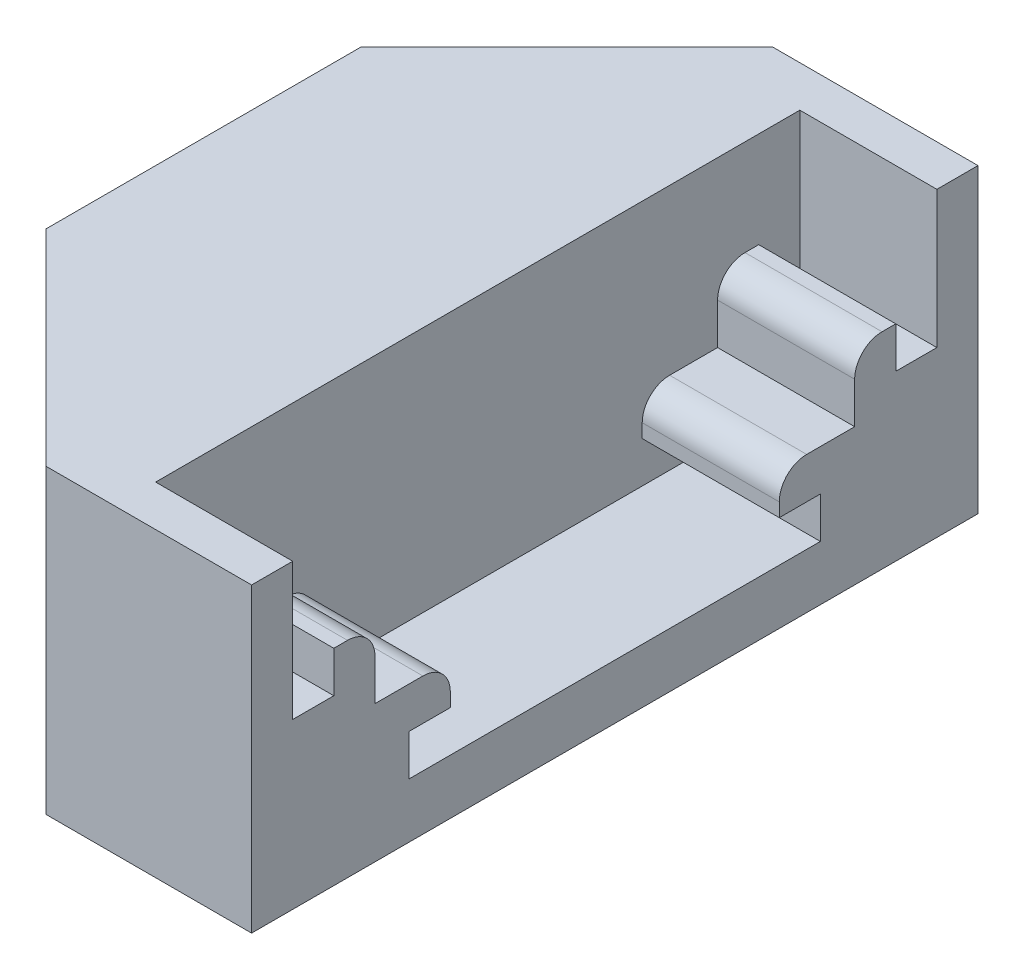
ISO-10303-21;
HEADER;
FILE_DESCRIPTION(('STEP AP214'),'2;1');
FILE_NAME('part.step','',(''),(''),'','','');
FILE_SCHEMA(('AUTOMOTIVE_DESIGN { 1 0 10303 214 1 1 1 1 }'));
ENDSEC;
DATA;
#1=APPLICATION_CONTEXT('core data for automotive mechanical design processes');
#2=APPLICATION_PROTOCOL_DEFINITION('international standard','automotive_design',2000,#1);
#3=PRODUCT_CONTEXT('',#1,'mechanical');
#4=PRODUCT('Part','Part','',(#3));
#5=PRODUCT_RELATED_PRODUCT_CATEGORY('part','',(#4));
#6=PRODUCT_DEFINITION_FORMATION('','',#4);
#7=PRODUCT_DEFINITION_CONTEXT('part definition',#1,'design');
#8=PRODUCT_DEFINITION('design','',#6,#7);
#9=PRODUCT_DEFINITION_SHAPE('','',#8);
#10=(LENGTH_UNIT() NAMED_UNIT(*) SI_UNIT(.MILLI.,.METRE.));
#11=(NAMED_UNIT(*) PLANE_ANGLE_UNIT() SI_UNIT($,.RADIAN.));
#12=(NAMED_UNIT(*) SI_UNIT($,.STERADIAN.) SOLID_ANGLE_UNIT());
#13=UNCERTAINTY_MEASURE_WITH_UNIT(LENGTH_MEASURE(1.E-05),#10,'distance_accuracy_value','');
#14=(GEOMETRIC_REPRESENTATION_CONTEXT(3) GLOBAL_UNCERTAINTY_ASSIGNED_CONTEXT((#13)) GLOBAL_UNIT_ASSIGNED_CONTEXT((#10,
#11,#12)) REPRESENTATION_CONTEXT('',''));
#15=CARTESIAN_POINT('',(0.,0.,0.));
#16=DIRECTION('',(0.,0.,1.));
#17=DIRECTION('',(1.,0.,0.));
#18=AXIS2_PLACEMENT_3D('',#15,#16,#17);
#19=CARTESIAN_POINT('',(10.,-27.5,0.));
#20=DIRECTION('',(0.,1.,0.));
#21=DIRECTION('',(0.,0.,1.));
#22=AXIS2_PLACEMENT_3D('',#19,#20,#21);
#23=PLANE('',#22);
#24=DIRECTION('',(-1.,0.,0.));
#25=VECTOR('',#24,1.);
#26=CARTESIAN_POINT('',(10.,-27.5,26.5));
#27=LINE('',#26,#25);
#28=CARTESIAN_POINT('',(10.,-27.5,26.5));
#29=VERTEX_POINT('',#28);
#30=CARTESIAN_POINT('',(-4.99999999999995,-27.5,26.5));
#31=VERTEX_POINT('',#30);
#32=EDGE_CURVE('E368',#29,#31,#27,.T.);
#33=ORIENTED_EDGE('',*,*,#32,.T.);
#34=DIRECTION('',(0.707106781186549,0.,0.707106781186546));
#35=VECTOR('',#34,1.);
#36=CARTESIAN_POINT('',(-20.,-27.5,11.5));
#37=LINE('',#36,#35);
#38=CARTESIAN_POINT('',(-20.,-27.5,11.5));
#39=VERTEX_POINT('',#38);
#40=EDGE_CURVE('E11',#31,#39,#37,.F.);
#41=ORIENTED_EDGE('',*,*,#40,.T.);
#42=DIRECTION('',(0.,0.,1.));
#43=VECTOR('',#42,1.);
#44=CARTESIAN_POINT('',(-20.,-27.5,26.5));
#45=LINE('',#44,#43);
#46=CARTESIAN_POINT('',(-20.,-27.5,-11.5));
#47=VERTEX_POINT('',#46);
#48=EDGE_CURVE('E335',#47,#39,#45,.T.);
#49=ORIENTED_EDGE('',*,*,#48,.F.);
#50=DIRECTION('',(0.707106781186549,0.,-0.707106781186546));
#51=VECTOR('',#50,1.);
#52=CARTESIAN_POINT('',(-20.,-27.5,-11.5));
#53=LINE('',#52,#51);
#54=CARTESIAN_POINT('',(-4.99999999999995,-27.5,-26.5));
#55=VERTEX_POINT('',#54);
#56=EDGE_CURVE('E255',#55,#47,#53,.F.);
#57=ORIENTED_EDGE('',*,*,#56,.F.);
#58=DIRECTION('',(-1.,0.,0.));
#59=VECTOR('',#58,1.);
#60=CARTESIAN_POINT('',(10.,-27.5,-26.5));
#61=LINE('',#60,#59);
#62=CARTESIAN_POINT('',(10.,-27.5,-26.5));
#63=VERTEX_POINT('',#62);
#64=EDGE_CURVE('E279',#63,#55,#61,.T.);
#65=ORIENTED_EDGE('',*,*,#64,.F.);
#66=DIRECTION('',(0.,0.,-1.));
#67=VECTOR('',#66,1.);
#68=CARTESIAN_POINT('',(10.,-27.5,0.));
#69=LINE('',#68,#67);
#70=EDGE_CURVE('E339',#29,#63,#69,.T.);
#71=ORIENTED_EDGE('',*,*,#70,.F.);
#72=EDGE_LOOP('',(#33,#41,#49,#57,#65,#71));
#73=FACE_BOUND('',#72,.T.);
#74=ADVANCED_FACE('F45',(#73),#23,.F.);
#75=CARTESIAN_POINT('',(10.,-23.5,15.));
#76=DIRECTION('',(0.,-1.,0.));
#77=DIRECTION('',(0.,0.,-1.));
#78=AXIS2_PLACEMENT_3D('',#75,#76,#77);
#79=PLANE('',#78);
#80=DIRECTION('',(0.,0.,1.));
#81=VECTOR('',#80,1.);
#82=CARTESIAN_POINT('',(0.,-23.5,15.));
#83=LINE('',#82,#81);
#84=CARTESIAN_POINT('',(0.,-23.5,-15.));
#85=VERTEX_POINT('',#84);
#86=CARTESIAN_POINT('',(0.,-23.5,15.));
#87=VERTEX_POINT('',#86);
#88=EDGE_CURVE('E337',#85,#87,#83,.T.);
#89=ORIENTED_EDGE('',*,*,#88,.T.);
#90=DIRECTION('',(-1.,0.,0.));
#91=VECTOR('',#90,1.);
#92=CARTESIAN_POINT('',(10.,-23.5,15.));
#93=LINE('',#92,#91);
#94=CARTESIAN_POINT('',(10.,-23.5,15.));
#95=VERTEX_POINT('',#94);
#96=EDGE_CURVE('E418',#95,#87,#93,.T.);
#97=ORIENTED_EDGE('',*,*,#96,.F.);
#98=DIRECTION('',(0.,0.,1.));
#99=VECTOR('',#98,1.);
#100=CARTESIAN_POINT('',(10.,-23.5,15.));
#101=LINE('',#100,#99);
#102=CARTESIAN_POINT('',(10.,-23.5,-15.));
#103=VERTEX_POINT('',#102);
#104=EDGE_CURVE('E341',#103,#95,#101,.T.);
#105=ORIENTED_EDGE('',*,*,#104,.F.);
#106=DIRECTION('',(-1.,0.,0.));
#107=VECTOR('',#106,1.);
#108=CARTESIAN_POINT('',(10.,-23.5,-15.));
#109=LINE('',#108,#107);
#110=EDGE_CURVE('E301',#103,#85,#109,.T.);
#111=ORIENTED_EDGE('',*,*,#110,.T.);
#112=EDGE_LOOP('',(#89,#97,#105,#111));
#113=FACE_BOUND('',#112,.T.);
#114=ADVANCED_FACE('F524',(#113),#79,.F.);
#115=CARTESIAN_POINT('',(10.,-20.5,15.));
#116=DIRECTION('',(0.,0.,1.));
#117=DIRECTION('',(1.,0.,0.));
#118=AXIS2_PLACEMENT_3D('',#115,#116,#117);
#119=PLANE('',#118);
#120=DIRECTION('',(0.,1.,0.));
#121=VECTOR('',#120,1.);
#122=CARTESIAN_POINT('',(0.,-20.5,15.));
#123=LINE('',#122,#121);
#124=CARTESIAN_POINT('',(0.,-20.5,15.));
#125=VERTEX_POINT('',#124);
#126=EDGE_CURVE('E371',#87,#125,#123,.T.);
#127=ORIENTED_EDGE('',*,*,#126,.T.);
#128=DIRECTION('',(-1.,0.,0.));
#129=VECTOR('',#128,1.);
#130=CARTESIAN_POINT('',(10.,-20.5,15.));
#131=LINE('',#130,#129);
#132=CARTESIAN_POINT('',(10.,-20.5,15.));
#133=VERTEX_POINT('',#132);
#134=EDGE_CURVE('E415',#133,#125,#131,.T.);
#135=ORIENTED_EDGE('',*,*,#134,.F.);
#136=DIRECTION('',(0.,1.,0.));
#137=VECTOR('',#136,1.);
#138=CARTESIAN_POINT('',(10.,-20.5,15.));
#139=LINE('',#138,#137);
#140=EDGE_CURVE('E344',#95,#133,#139,.T.);
#141=ORIENTED_EDGE('',*,*,#140,.F.);
#142=ORIENTED_EDGE('',*,*,#96,.T.);
#143=EDGE_LOOP('',(#127,#135,#141,#142));
#144=FACE_BOUND('',#143,.T.);
#145=ADVANCED_FACE('F531',(#144),#119,.F.);
#146=CARTESIAN_POINT('',(10.,-20.5,12.));
#147=DIRECTION('',(0.,1.,0.));
#148=DIRECTION('',(0.,0.,1.));
#149=AXIS2_PLACEMENT_3D('',#146,#147,#148);
#150=PLANE('',#149);
#151=DIRECTION('',(0.,0.,-1.));
#152=VECTOR('',#151,1.);
#153=CARTESIAN_POINT('',(0.,-20.5,12.));
#154=LINE('',#153,#152);
#155=CARTESIAN_POINT('',(0.,-20.5,12.));
#156=VERTEX_POINT('',#155);
#157=EDGE_CURVE('E374',#125,#156,#154,.T.);
#158=ORIENTED_EDGE('',*,*,#157,.T.);
#159=DIRECTION('',(-1.,0.,0.));
#160=VECTOR('',#159,1.);
#161=CARTESIAN_POINT('',(10.,-20.5,12.));
#162=LINE('',#161,#160);
#163=CARTESIAN_POINT('',(10.,-20.5,12.));
#164=VERTEX_POINT('',#163);
#165=EDGE_CURVE('E412',#164,#156,#162,.T.);
#166=ORIENTED_EDGE('',*,*,#165,.F.);
#167=DIRECTION('',(0.,0.,-1.));
#168=VECTOR('',#167,1.);
#169=CARTESIAN_POINT('',(10.,-20.5,12.));
#170=LINE('',#169,#168);
#171=EDGE_CURVE('E346',#133,#164,#170,.T.);
#172=ORIENTED_EDGE('',*,*,#171,.F.);
#173=ORIENTED_EDGE('',*,*,#134,.T.);
#174=EDGE_LOOP('',(#158,#166,#172,#173));
#175=FACE_BOUND('',#174,.T.);
#176=ADVANCED_FACE('F533',(#175),#150,.F.);
#177=CARTESIAN_POINT('',(10.,-20.5,12.));
#178=DIRECTION('',(0.,0.,1.));
#179=DIRECTION('',(0.,-1.,0.));
#180=AXIS2_PLACEMENT_3D('',#177,#178,#179);
#181=PLANE('',#180);
#182=DIRECTION('',(0.,1.,0.));
#183=VECTOR('',#182,1.);
#184=CARTESIAN_POINT('',(0.,-20.5,12.));
#185=LINE('',#184,#183);
#186=CARTESIAN_POINT('',(0.,-19.5,12.));
#187=VERTEX_POINT('',#186);
#188=EDGE_CURVE('E377',#156,#187,#185,.T.);
#189=ORIENTED_EDGE('',*,*,#188,.T.);
#190=DIRECTION('',(-1.,0.,0.));
#191=VECTOR('',#190,1.);
#192=CARTESIAN_POINT('',(10.,-19.5,12.));
#193=LINE('',#192,#191);
#194=CARTESIAN_POINT('',(10.,-19.5,12.));
#195=VERTEX_POINT('',#194);
#196=EDGE_CURVE('E428',#187,#195,#193,.F.);
#197=ORIENTED_EDGE('',*,*,#196,.T.);
#198=DIRECTION('',(0.,1.,0.));
#199=VECTOR('',#198,1.);
#200=CARTESIAN_POINT('',(10.,-20.5,12.));
#201=LINE('',#200,#199);
#202=EDGE_CURVE('E348',#164,#195,#201,.T.);
#203=ORIENTED_EDGE('',*,*,#202,.F.);
#204=ORIENTED_EDGE('',*,*,#165,.T.);
#205=EDGE_LOOP('',(#189,#197,#203,#204));
#206=FACE_BOUND('',#205,.T.);
#207=ADVANCED_FACE('F536',(#206),#181,.F.);
#208=CARTESIAN_POINT('',(10.,-17.5,17.5));
#209=DIRECTION('',(0.,-1.,0.));
#210=DIRECTION('',(0.,0.,-1.));
#211=AXIS2_PLACEMENT_3D('',#208,#209,#210);
#212=PLANE('',#211);
#213=DIRECTION('',(0.,0.,1.));
#214=VECTOR('',#213,1.);
#215=CARTESIAN_POINT('',(10.,-17.5,17.5));
#216=LINE('',#215,#214);
#217=CARTESIAN_POINT('',(10.,-17.5,14.));
#218=VERTEX_POINT('',#217);
#219=CARTESIAN_POINT('',(10.,-17.5,17.5));
#220=VERTEX_POINT('',#219);
#221=EDGE_CURVE('E351',#218,#220,#216,.T.);
#222=ORIENTED_EDGE('',*,*,#221,.F.);
#223=DIRECTION('',(-1.,0.,0.));
#224=VECTOR('',#223,1.);
#225=CARTESIAN_POINT('',(10.,-17.5,14.));
#226=LINE('',#225,#224);
#227=CARTESIAN_POINT('',(0.,-17.5,14.));
#228=VERTEX_POINT('',#227);
#229=EDGE_CURVE('E421',#218,#228,#226,.T.);
#230=ORIENTED_EDGE('',*,*,#229,.T.);
#231=DIRECTION('',(0.,0.,1.));
#232=VECTOR('',#231,1.);
#233=CARTESIAN_POINT('',(0.,-17.5,17.5));
#234=LINE('',#233,#232);
#235=CARTESIAN_POINT('',(0.,-17.5,17.5));
#236=VERTEX_POINT('',#235);
#237=EDGE_CURVE('E380',#228,#236,#234,.T.);
#238=ORIENTED_EDGE('',*,*,#237,.T.);
#239=DIRECTION('',(-1.,0.,0.));
#240=VECTOR('',#239,1.);
#241=CARTESIAN_POINT('',(10.,-17.5,17.5));
#242=LINE('',#241,#240);
#243=EDGE_CURVE('E409',#220,#236,#242,.T.);
#244=ORIENTED_EDGE('',*,*,#243,.F.);
#245=EDGE_LOOP('',(#222,#230,#238,#244));
#246=FACE_BOUND('',#245,.T.);
#247=ADVANCED_FACE('F545',(#246),#212,.F.);
#248=CARTESIAN_POINT('',(10.,-12.5,17.5));
#249=DIRECTION('',(0.,0.,1.));
#250=DIRECTION('',(1.,0.,0.));
#251=AXIS2_PLACEMENT_3D('',#248,#249,#250);
#252=PLANE('',#251);
#253=DIRECTION('',(0.,1.,0.));
#254=VECTOR('',#253,1.);
#255=CARTESIAN_POINT('',(0.,-12.5,17.5));
#256=LINE('',#255,#254);
#257=CARTESIAN_POINT('',(0.,-14.5,17.5));
#258=VERTEX_POINT('',#257);
#259=EDGE_CURVE('E383',#236,#258,#256,.T.);
#260=ORIENTED_EDGE('',*,*,#259,.T.);
#261=DIRECTION('',(-1.,0.,0.));
#262=VECTOR('',#261,1.);
#263=CARTESIAN_POINT('',(10.,-14.5,17.5));
#264=LINE('',#263,#262);
#265=CARTESIAN_POINT('',(10.,-14.5,17.5));
#266=VERTEX_POINT('',#265);
#267=EDGE_CURVE('E437',#258,#266,#264,.F.);
#268=ORIENTED_EDGE('',*,*,#267,.T.);
#269=DIRECTION('',(0.,1.,0.));
#270=VECTOR('',#269,1.);
#271=CARTESIAN_POINT('',(10.,-12.5,17.5));
#272=LINE('',#271,#270);
#273=EDGE_CURVE('E353',#220,#266,#272,.T.);
#274=ORIENTED_EDGE('',*,*,#273,.F.);
#275=ORIENTED_EDGE('',*,*,#243,.T.);
#276=EDGE_LOOP('',(#260,#268,#274,#275));
#277=FACE_BOUND('',#276,.T.);
#278=ADVANCED_FACE('F616',(#277),#252,.F.);
#279=CARTESIAN_POINT('',(10.,-12.5,20.5));
#280=DIRECTION('',(0.,-1.,0.));
#281=DIRECTION('',(0.,0.,-1.));
#282=AXIS2_PLACEMENT_3D('',#279,#280,#281);
#283=PLANE('',#282);
#284=DIRECTION('',(0.,0.,1.));
#285=VECTOR('',#284,1.);
#286=CARTESIAN_POINT('',(10.,-12.5,20.5));
#287=LINE('',#286,#285);
#288=CARTESIAN_POINT('',(10.,-12.5,19.5));
#289=VERTEX_POINT('',#288);
#290=CARTESIAN_POINT('',(10.,-12.5,20.5));
#291=VERTEX_POINT('',#290);
#292=EDGE_CURVE('E356',#289,#291,#287,.T.);
#293=ORIENTED_EDGE('',*,*,#292,.F.);
#294=DIRECTION('',(-1.,0.,0.));
#295=VECTOR('',#294,1.);
#296=CARTESIAN_POINT('',(10.,-12.5,19.5));
#297=LINE('',#296,#295);
#298=CARTESIAN_POINT('',(0.,-12.5,19.5));
#299=VERTEX_POINT('',#298);
#300=EDGE_CURVE('E434',#289,#299,#297,.T.);
#301=ORIENTED_EDGE('',*,*,#300,.T.);
#302=DIRECTION('',(0.,0.,1.));
#303=VECTOR('',#302,1.);
#304=CARTESIAN_POINT('',(0.,-12.5,20.5));
#305=LINE('',#304,#303);
#306=CARTESIAN_POINT('',(0.,-12.5,20.5));
#307=VERTEX_POINT('',#306);
#308=EDGE_CURVE('E386',#299,#307,#305,.T.);
#309=ORIENTED_EDGE('',*,*,#308,.T.);
#310=DIRECTION('',(-1.,0.,0.));
#311=VECTOR('',#310,1.);
#312=CARTESIAN_POINT('',(10.,-12.5,20.5));
#313=LINE('',#312,#311);
#314=EDGE_CURVE('E406',#291,#307,#313,.T.);
#315=ORIENTED_EDGE('',*,*,#314,.F.);
#316=EDGE_LOOP('',(#293,#301,#309,#315));
#317=FACE_BOUND('',#316,.T.);
#318=ADVANCED_FACE('F557',(#317),#283,.F.);
#319=CARTESIAN_POINT('',(10.,-15.5,20.5));
#320=DIRECTION('',(0.,0.,-1.));
#321=DIRECTION('',(-1.,0.,0.));
#322=AXIS2_PLACEMENT_3D('',#319,#320,#321);
#323=PLANE('',#322);
#324=DIRECTION('',(0.,-1.,0.));
#325=VECTOR('',#324,1.);
#326=CARTESIAN_POINT('',(0.,-15.5,20.5));
#327=LINE('',#326,#325);
#328=CARTESIAN_POINT('',(0.,-15.5,20.5));
#329=VERTEX_POINT('',#328);
#330=EDGE_CURVE('E389',#307,#329,#327,.T.);
#331=ORIENTED_EDGE('',*,*,#330,.T.);
#332=DIRECTION('',(-1.,0.,0.));
#333=VECTOR('',#332,1.);
#334=CARTESIAN_POINT('',(10.,-15.5,20.5));
#335=LINE('',#334,#333);
#336=CARTESIAN_POINT('',(10.,-15.5,20.5));
#337=VERTEX_POINT('',#336);
#338=EDGE_CURVE('E403',#337,#329,#335,.T.);
#339=ORIENTED_EDGE('',*,*,#338,.F.);
#340=DIRECTION('',(0.,-1.,0.));
#341=VECTOR('',#340,1.);
#342=CARTESIAN_POINT('',(10.,-15.5,20.5));
#343=LINE('',#342,#341);
#344=EDGE_CURVE('E358',#291,#337,#343,.T.);
#345=ORIENTED_EDGE('',*,*,#344,.F.);
#346=ORIENTED_EDGE('',*,*,#314,.T.);
#347=EDGE_LOOP('',(#331,#339,#345,#346));
#348=FACE_BOUND('',#347,.T.);
#349=ADVANCED_FACE('F564',(#348),#323,.F.);
#350=CARTESIAN_POINT('',(10.,-15.5,23.5));
#351=DIRECTION('',(0.,-1.,0.));
#352=DIRECTION('',(0.,0.,-1.));
#353=AXIS2_PLACEMENT_3D('',#350,#351,#352);
#354=PLANE('',#353);
#355=DIRECTION('',(0.,0.,1.));
#356=VECTOR('',#355,1.);
#357=CARTESIAN_POINT('',(0.,-15.5,23.5));
#358=LINE('',#357,#356);
#359=CARTESIAN_POINT('',(0.,-15.5,23.5));
#360=VERTEX_POINT('',#359);
#361=EDGE_CURVE('E392',#329,#360,#358,.T.);
#362=ORIENTED_EDGE('',*,*,#361,.T.);
#363=DIRECTION('',(-1.,0.,0.));
#364=VECTOR('',#363,1.);
#365=CARTESIAN_POINT('',(10.,-15.5,23.5));
#366=LINE('',#365,#364);
#367=CARTESIAN_POINT('',(10.,-15.5,23.5));
#368=VERTEX_POINT('',#367);
#369=EDGE_CURVE('E400',#368,#360,#366,.T.);
#370=ORIENTED_EDGE('',*,*,#369,.F.);
#371=DIRECTION('',(0.,0.,1.));
#372=VECTOR('',#371,1.);
#373=CARTESIAN_POINT('',(10.,-15.5,23.5));
#374=LINE('',#373,#372);
#375=EDGE_CURVE('E360',#337,#368,#374,.T.);
#376=ORIENTED_EDGE('',*,*,#375,.F.);
#377=ORIENTED_EDGE('',*,*,#338,.T.);
#378=EDGE_LOOP('',(#362,#370,#376,#377));
#379=FACE_BOUND('',#378,.T.);
#380=ADVANCED_FACE('F566',(#379),#354,.F.);
#381=CARTESIAN_POINT('',(10.,-5.50000000000001,23.5));
#382=DIRECTION('',(0.,0.,1.));
#383=DIRECTION('',(0.,-1.,0.));
#384=AXIS2_PLACEMENT_3D('',#381,#382,#383);
#385=PLANE('',#384);
#386=DIRECTION('',(0.,1.,0.));
#387=VECTOR('',#386,1.);
#388=CARTESIAN_POINT('',(0.,-5.50000000000001,23.5));
#389=LINE('',#388,#387);
#390=CARTESIAN_POINT('',(0.,-5.50000000000001,23.5));
#391=VERTEX_POINT('',#390);
#392=EDGE_CURVE('E342',#360,#391,#389,.T.);
#393=ORIENTED_EDGE('',*,*,#392,.T.);
#394=DIRECTION('',(-1.,0.,0.));
#395=VECTOR('',#394,1.);
#396=CARTESIAN_POINT('',(10.,-5.50000000000001,23.5));
#397=LINE('',#396,#395);
#398=CARTESIAN_POINT('',(10.,-5.50000000000001,23.5));
#399=VERTEX_POINT('',#398);
#400=EDGE_CURVE('E250',#399,#391,#397,.T.);
#401=ORIENTED_EDGE('',*,*,#400,.F.);
#402=DIRECTION('',(0.,1.,0.));
#403=VECTOR('',#402,1.);
#404=CARTESIAN_POINT('',(10.,-5.50000000000001,23.5));
#405=LINE('',#404,#403);
#406=EDGE_CURVE('E362',#368,#399,#405,.T.);
#407=ORIENTED_EDGE('',*,*,#406,.F.);
#408=ORIENTED_EDGE('',*,*,#369,.T.);
#409=EDGE_LOOP('',(#393,#401,#407,#408));
#410=FACE_BOUND('',#409,.T.);
#411=ADVANCED_FACE('F569',(#410),#385,.F.);
#412=CARTESIAN_POINT('',(10.,-5.50000000000001,23.5));
#413=DIRECTION('',(0.,-1.,0.));
#414=DIRECTION('',(0.,0.,-1.));
#415=AXIS2_PLACEMENT_3D('',#412,#413,#414);
#416=PLANE('',#415);
#417=DIRECTION('',(0.,0.,-1.));
#418=VECTOR('',#417,1.);
#419=CARTESIAN_POINT('',(-20.,-5.50000000000001,26.5));
#420=LINE('',#419,#418);
#421=CARTESIAN_POINT('',(-20.,-5.50000000000001,11.5));
#422=VERTEX_POINT('',#421);
#423=CARTESIAN_POINT('',(-20.,-5.50000000000001,-11.5));
#424=VERTEX_POINT('',#423);
#425=EDGE_CURVE('E254',#422,#424,#420,.T.);
#426=ORIENTED_EDGE('',*,*,#425,.F.);
#427=DIRECTION('',(-0.707106781186549,0.,-0.707106781186546));
#428=VECTOR('',#427,1.);
#429=CARTESIAN_POINT('',(-20.,-5.5,11.5));
#430=LINE('',#429,#428);
#431=CARTESIAN_POINT('',(-4.99999999999995,-5.50000000000001,26.5));
#432=VERTEX_POINT('',#431);
#433=EDGE_CURVE('E68',#422,#432,#430,.F.);
#434=ORIENTED_EDGE('',*,*,#433,.T.);
#435=DIRECTION('',(-1.,0.,0.));
#436=VECTOR('',#435,1.);
#437=CARTESIAN_POINT('',(10.,-5.50000000000001,26.5));
#438=LINE('',#437,#436);
#439=CARTESIAN_POINT('',(10.,-5.50000000000001,26.5));
#440=VERTEX_POINT('',#439);
#441=EDGE_CURVE('E397',#440,#432,#438,.T.);
#442=ORIENTED_EDGE('',*,*,#441,.F.);
#443=DIRECTION('',(0.,0.,1.));
#444=VECTOR('',#443,1.);
#445=CARTESIAN_POINT('',(10.,-5.50000000000001,23.5));
#446=LINE('',#445,#444);
#447=EDGE_CURVE('E364',#399,#440,#446,.T.);
#448=ORIENTED_EDGE('',*,*,#447,.F.);
#449=ORIENTED_EDGE('',*,*,#400,.T.);
#450=DIRECTION('',(0.,0.,-1.));
#451=VECTOR('',#450,1.);
#452=CARTESIAN_POINT('',(0.,-5.50000000000001,26.5));
#453=LINE('',#452,#451);
#454=CARTESIAN_POINT('',(0.,-5.5,-23.5));
#455=VERTEX_POINT('',#454);
#456=EDGE_CURVE('E242',#391,#455,#453,.T.);
#457=ORIENTED_EDGE('',*,*,#456,.T.);
#458=DIRECTION('',(-1.,0.,0.));
#459=VECTOR('',#458,1.);
#460=CARTESIAN_POINT('',(10.,-5.5,-23.5));
#461=LINE('',#460,#459);
#462=CARTESIAN_POINT('',(10.,-5.5,-23.5));
#463=VERTEX_POINT('',#462);
#464=EDGE_CURVE('E246',#463,#455,#461,.T.);
#465=ORIENTED_EDGE('',*,*,#464,.F.);
#466=DIRECTION('',(0.,0.,-1.));
#467=VECTOR('',#466,1.);
#468=CARTESIAN_POINT('',(10.,-5.5,-23.5));
#469=LINE('',#468,#467);
#470=CARTESIAN_POINT('',(10.,-5.5,-26.5));
#471=VERTEX_POINT('',#470);
#472=EDGE_CURVE('E460',#463,#471,#469,.T.);
#473=ORIENTED_EDGE('',*,*,#472,.T.);
#474=DIRECTION('',(-1.,0.,0.));
#475=VECTOR('',#474,1.);
#476=CARTESIAN_POINT('',(10.,-5.5,-26.5));
#477=LINE('',#476,#475);
#478=CARTESIAN_POINT('',(-4.99999999999995,-5.5,-26.5));
#479=VERTEX_POINT('',#478);
#480=EDGE_CURVE('E264',#471,#479,#477,.T.);
#481=ORIENTED_EDGE('',*,*,#480,.T.);
#482=DIRECTION('',(-0.707106781186549,0.,0.707106781186546));
#483=VECTOR('',#482,1.);
#484=CARTESIAN_POINT('',(-20.,-5.5,-11.5));
#485=LINE('',#484,#483);
#486=EDGE_CURVE('E327',#424,#479,#485,.F.);
#487=ORIENTED_EDGE('',*,*,#486,.F.);
#488=EDGE_LOOP('',(#426,#434,#442,#448,#449,#457,#465,#473,#481,#487));
#489=FACE_BOUND('',#488,.T.);
#490=ADVANCED_FACE('F244',(#489),#416,.F.);
#491=CARTESIAN_POINT('',(10.,-27.5,26.5));
#492=DIRECTION('',(0.,0.,-1.));
#493=DIRECTION('',(-1.,0.,0.));
#494=AXIS2_PLACEMENT_3D('',#491,#492,#493);
#495=PLANE('',#494);
#496=ORIENTED_EDGE('',*,*,#441,.T.);
#497=DIRECTION('',(0.,-1.,0.));
#498=VECTOR('',#497,1.);
#499=CARTESIAN_POINT('',(-4.99999999999995,-27.5,26.5));
#500=LINE('',#499,#498);
#501=EDGE_CURVE('E54',#432,#31,#500,.T.);
#502=ORIENTED_EDGE('',*,*,#501,.T.);
#503=ORIENTED_EDGE('',*,*,#32,.F.);
#504=DIRECTION('',(0.,-1.,0.));
#505=VECTOR('',#504,1.);
#506=CARTESIAN_POINT('',(10.,-27.5,26.5));
#507=LINE('',#506,#505);
#508=EDGE_CURVE('E366',#440,#29,#507,.T.);
#509=ORIENTED_EDGE('',*,*,#508,.F.);
#510=EDGE_LOOP('',(#496,#502,#503,#509));
#511=FACE_BOUND('',#510,.T.);
#512=ADVANCED_FACE('F571',(#511),#495,.F.);
#513=CARTESIAN_POINT('',(10.,0.,0.));
#514=DIRECTION('',(-1.,0.,0.));
#515=DIRECTION('',(0.,0.,1.));
#516=AXIS2_PLACEMENT_3D('',#513,#514,#515);
#517=PLANE('',#516);
#518=ORIENTED_EDGE('',*,*,#202,.T.);
#519=CARTESIAN_POINT('',(10.,-19.5,14.));
#520=DIRECTION('',(-1.,0.,0.));
#521=DIRECTION('',(0.,0.,1.));
#522=AXIS2_PLACEMENT_3D('',#519,#520,#521);
#523=CIRCLE('',#522,2.);
#524=EDGE_CURVE('E432',#195,#218,#523,.F.);
#525=ORIENTED_EDGE('',*,*,#524,.T.);
#526=ORIENTED_EDGE('',*,*,#221,.T.);
#527=ORIENTED_EDGE('',*,*,#273,.T.);
#528=CARTESIAN_POINT('',(10.,-14.5,19.5));
#529=DIRECTION('',(-1.,0.,0.));
#530=DIRECTION('',(0.,0.,1.));
#531=AXIS2_PLACEMENT_3D('',#528,#529,#530);
#532=CIRCLE('',#531,2.);
#533=EDGE_CURVE('E430',#266,#289,#532,.F.);
#534=ORIENTED_EDGE('',*,*,#533,.T.);
#535=ORIENTED_EDGE('',*,*,#292,.T.);
#536=ORIENTED_EDGE('',*,*,#344,.T.);
#537=ORIENTED_EDGE('',*,*,#375,.T.);
#538=ORIENTED_EDGE('',*,*,#406,.T.);
#539=ORIENTED_EDGE('',*,*,#447,.T.);
#540=ORIENTED_EDGE('',*,*,#508,.T.);
#541=ORIENTED_EDGE('',*,*,#70,.T.);
#542=DIRECTION('',(0.,-1.,0.));
#543=VECTOR('',#542,1.);
#544=CARTESIAN_POINT('',(10.,-27.5,-26.5));
#545=LINE('',#544,#543);
#546=EDGE_CURVE('E282',#471,#63,#545,.T.);
#547=ORIENTED_EDGE('',*,*,#546,.F.);
#548=ORIENTED_EDGE('',*,*,#472,.F.);
#549=DIRECTION('',(0.,1.,0.));
#550=VECTOR('',#549,1.);
#551=CARTESIAN_POINT('',(10.,-5.5,-23.5));
#552=LINE('',#551,#550);
#553=CARTESIAN_POINT('',(10.,-15.5,-23.5));
#554=VERTEX_POINT('',#553);
#555=EDGE_CURVE('E262',#554,#463,#552,.T.);
#556=ORIENTED_EDGE('',*,*,#555,.F.);
#557=DIRECTION('',(0.,0.,-1.));
#558=VECTOR('',#557,1.);
#559=CARTESIAN_POINT('',(10.,-15.5,-23.5));
#560=LINE('',#559,#558);
#561=CARTESIAN_POINT('',(10.,-15.5,-20.5));
#562=VERTEX_POINT('',#561);
#563=EDGE_CURVE('E493',#562,#554,#560,.T.);
#564=ORIENTED_EDGE('',*,*,#563,.F.);
#565=DIRECTION('',(0.,-1.,0.));
#566=VECTOR('',#565,1.);
#567=CARTESIAN_POINT('',(10.,-15.5,-20.5));
#568=LINE('',#567,#566);
#569=CARTESIAN_POINT('',(10.,-12.5,-20.5));
#570=VERTEX_POINT('',#569);
#571=EDGE_CURVE('E489',#570,#562,#568,.T.);
#572=ORIENTED_EDGE('',*,*,#571,.F.);
#573=DIRECTION('',(0.,0.,-1.));
#574=VECTOR('',#573,1.);
#575=CARTESIAN_POINT('',(10.,-12.5,-20.5));
#576=LINE('',#575,#574);
#577=CARTESIAN_POINT('',(10.,-12.5,-19.5));
#578=VERTEX_POINT('',#577);
#579=EDGE_CURVE('E495',#578,#570,#576,.T.);
#580=ORIENTED_EDGE('',*,*,#579,.F.);
#581=CARTESIAN_POINT('',(10.,-14.5,-19.5));
#582=DIRECTION('',(1.,0.,0.));
#583=DIRECTION('',(0.,0.,-1.));
#584=AXIS2_PLACEMENT_3D('',#581,#582,#583);
#585=CIRCLE('',#584,2.);
#586=CARTESIAN_POINT('',(10.,-14.5,-17.5));
#587=VERTEX_POINT('',#586);
#588=EDGE_CURVE('E314',#587,#578,#585,.F.);
#589=ORIENTED_EDGE('',*,*,#588,.F.);
#590=DIRECTION('',(0.,1.,0.));
#591=VECTOR('',#590,1.);
#592=CARTESIAN_POINT('',(10.,-12.5,-17.5));
#593=LINE('',#592,#591);
#594=CARTESIAN_POINT('',(10.,-17.5,-17.5));
#595=VERTEX_POINT('',#594);
#596=EDGE_CURVE('E499',#595,#587,#593,.T.);
#597=ORIENTED_EDGE('',*,*,#596,.F.);
#598=DIRECTION('',(0.,0.,-1.));
#599=VECTOR('',#598,1.);
#600=CARTESIAN_POINT('',(10.,-17.5,-17.5));
#601=LINE('',#600,#599);
#602=CARTESIAN_POINT('',(10.,-17.5,-14.));
#603=VERTEX_POINT('',#602);
#604=EDGE_CURVE('E502',#603,#595,#601,.T.);
#605=ORIENTED_EDGE('',*,*,#604,.F.);
#606=CARTESIAN_POINT('',(10.,-19.5,-14.));
#607=DIRECTION('',(1.,0.,0.));
#608=DIRECTION('',(0.,0.,-1.));
#609=AXIS2_PLACEMENT_3D('',#606,#607,#608);
#610=CIRCLE('',#609,2.);
#611=CARTESIAN_POINT('',(10.,-19.5,-12.));
#612=VERTEX_POINT('',#611);
#613=EDGE_CURVE('E316',#612,#603,#610,.F.);
#614=ORIENTED_EDGE('',*,*,#613,.F.);
#615=DIRECTION('',(0.,1.,0.));
#616=VECTOR('',#615,1.);
#617=CARTESIAN_POINT('',(10.,-20.5,-12.));
#618=LINE('',#617,#616);
#619=CARTESIAN_POINT('',(10.,-20.5,-12.));
#620=VERTEX_POINT('',#619);
#621=EDGE_CURVE('E505',#620,#612,#618,.T.);
#622=ORIENTED_EDGE('',*,*,#621,.F.);
#623=DIRECTION('',(0.,0.,1.));
#624=VECTOR('',#623,1.);
#625=CARTESIAN_POINT('',(10.,-20.5,-12.));
#626=LINE('',#625,#624);
#627=CARTESIAN_POINT('',(10.,-20.5,-15.));
#628=VERTEX_POINT('',#627);
#629=EDGE_CURVE('E273',#628,#620,#626,.T.);
#630=ORIENTED_EDGE('',*,*,#629,.F.);
#631=DIRECTION('',(0.,1.,0.));
#632=VECTOR('',#631,1.);
#633=CARTESIAN_POINT('',(10.,-20.5,-15.));
#634=LINE('',#633,#632);
#635=EDGE_CURVE('E270',#103,#628,#634,.T.);
#636=ORIENTED_EDGE('',*,*,#635,.F.);
#637=ORIENTED_EDGE('',*,*,#104,.T.);
#638=ORIENTED_EDGE('',*,*,#140,.T.);
#639=ORIENTED_EDGE('',*,*,#171,.T.);
#640=EDGE_LOOP('',(#518,#525,#526,#527,#534,#535,#536,#537,#538,#539,#540,#541,#547,#548,#556,
#564,#572,#580,#589,#597,#605,#614,#622,#630,#636,#637,#638,#639));
#641=FACE_BOUND('',#640,.T.);
#642=ADVANCED_FACE('F514',(#641),#517,.F.);
#643=CARTESIAN_POINT('',(10.,-19.5,14.));
#644=DIRECTION('',(-1.,0.,0.));
#645=DIRECTION('',(0.,0.,1.));
#646=AXIS2_PLACEMENT_3D('',#643,#644,#645);
#647=CYLINDRICAL_SURFACE('',#646,2.);
#648=ORIENTED_EDGE('',*,*,#524,.F.);
#649=ORIENTED_EDGE('',*,*,#196,.F.);
#650=CARTESIAN_POINT('',(0.,-19.5,14.));
#651=DIRECTION('',(-1.,0.,0.));
#652=DIRECTION('',(0.,0.,1.));
#653=AXIS2_PLACEMENT_3D('',#650,#651,#652);
#654=CIRCLE('',#653,2.);
#655=EDGE_CURVE('E426',#228,#187,#654,.T.);
#656=ORIENTED_EDGE('',*,*,#655,.F.);
#657=ORIENTED_EDGE('',*,*,#229,.F.);
#658=EDGE_LOOP('',(#648,#649,#656,#657));
#659=FACE_BOUND('',#658,.T.);
#660=ADVANCED_FACE('F542',(#659),#647,.T.);
#661=CARTESIAN_POINT('',(10.,-14.5,19.5));
#662=DIRECTION('',(-1.,0.,0.));
#663=DIRECTION('',(0.,0.,1.));
#664=AXIS2_PLACEMENT_3D('',#661,#662,#663);
#665=CYLINDRICAL_SURFACE('',#664,2.);
#666=ORIENTED_EDGE('',*,*,#533,.F.);
#667=ORIENTED_EDGE('',*,*,#267,.F.);
#668=CARTESIAN_POINT('',(0.,-14.5,19.5));
#669=DIRECTION('',(-1.,0.,0.));
#670=DIRECTION('',(0.,0.,1.));
#671=AXIS2_PLACEMENT_3D('',#668,#669,#670);
#672=CIRCLE('',#671,2.);
#673=EDGE_CURVE('E424',#299,#258,#672,.T.);
#674=ORIENTED_EDGE('',*,*,#673,.F.);
#675=ORIENTED_EDGE('',*,*,#300,.F.);
#676=EDGE_LOOP('',(#666,#667,#674,#675));
#677=FACE_BOUND('',#676,.T.);
#678=ADVANCED_FACE('F554',(#677),#665,.T.);
#679=CARTESIAN_POINT('',(0.,0.,0.));
#680=DIRECTION('',(1.,0.,0.));
#681=DIRECTION('',(0.,0.,-1.));
#682=AXIS2_PLACEMENT_3D('',#679,#680,#681);
#683=PLANE('',#682);
#684=ORIENTED_EDGE('',*,*,#88,.F.);
#685=DIRECTION('',(0.,1.,0.));
#686=VECTOR('',#685,1.);
#687=CARTESIAN_POINT('',(0.,-20.5,-15.));
#688=LINE('',#687,#686);
#689=CARTESIAN_POINT('',(0.,-20.5,-15.));
#690=VERTEX_POINT('',#689);
#691=EDGE_CURVE('E465',#85,#690,#688,.T.);
#692=ORIENTED_EDGE('',*,*,#691,.T.);
#693=DIRECTION('',(0.,0.,1.));
#694=VECTOR('',#693,1.);
#695=CARTESIAN_POINT('',(0.,-20.5,-12.));
#696=LINE('',#695,#694);
#697=CARTESIAN_POINT('',(0.,-20.5,-12.));
#698=VERTEX_POINT('',#697);
#699=EDGE_CURVE('E468',#690,#698,#696,.T.);
#700=ORIENTED_EDGE('',*,*,#699,.T.);
#701=DIRECTION('',(0.,1.,0.));
#702=VECTOR('',#701,1.);
#703=CARTESIAN_POINT('',(0.,-20.5,-12.));
#704=LINE('',#703,#702);
#705=CARTESIAN_POINT('',(0.,-19.5,-12.));
#706=VERTEX_POINT('',#705);
#707=EDGE_CURVE('E471',#698,#706,#704,.T.);
#708=ORIENTED_EDGE('',*,*,#707,.T.);
#709=CARTESIAN_POINT('',(0.,-19.5,-14.));
#710=DIRECTION('',(1.,0.,0.));
#711=DIRECTION('',(0.,0.,-1.));
#712=AXIS2_PLACEMENT_3D('',#709,#710,#711);
#713=CIRCLE('',#712,2.);
#714=CARTESIAN_POINT('',(0.,-17.5,-14.));
#715=VERTEX_POINT('',#714);
#716=EDGE_CURVE('E309',#715,#706,#713,.T.);
#717=ORIENTED_EDGE('',*,*,#716,.F.);
#718=DIRECTION('',(0.,0.,-1.));
#719=VECTOR('',#718,1.);
#720=CARTESIAN_POINT('',(0.,-17.5,-17.5));
#721=LINE('',#720,#719);
#722=CARTESIAN_POINT('',(0.,-17.5,-17.5));
#723=VERTEX_POINT('',#722);
#724=EDGE_CURVE('E474',#715,#723,#721,.T.);
#725=ORIENTED_EDGE('',*,*,#724,.T.);
#726=DIRECTION('',(0.,1.,0.));
#727=VECTOR('',#726,1.);
#728=CARTESIAN_POINT('',(0.,-12.5,-17.5));
#729=LINE('',#728,#727);
#730=CARTESIAN_POINT('',(0.,-14.5,-17.5));
#731=VERTEX_POINT('',#730);
#732=EDGE_CURVE('E477',#723,#731,#729,.T.);
#733=ORIENTED_EDGE('',*,*,#732,.T.);
#734=CARTESIAN_POINT('',(0.,-14.5,-19.5));
#735=DIRECTION('',(1.,0.,0.));
#736=DIRECTION('',(0.,0.,-1.));
#737=AXIS2_PLACEMENT_3D('',#734,#735,#736);
#738=CIRCLE('',#737,2.);
#739=CARTESIAN_POINT('',(0.,-12.5,-19.5));
#740=VERTEX_POINT('',#739);
#741=EDGE_CURVE('E307',#740,#731,#738,.T.);
#742=ORIENTED_EDGE('',*,*,#741,.F.);
#743=DIRECTION('',(0.,0.,-1.));
#744=VECTOR('',#743,1.);
#745=CARTESIAN_POINT('',(0.,-12.5,-20.5));
#746=LINE('',#745,#744);
#747=CARTESIAN_POINT('',(0.,-12.5,-20.5));
#748=VERTEX_POINT('',#747);
#749=EDGE_CURVE('E480',#740,#748,#746,.T.);
#750=ORIENTED_EDGE('',*,*,#749,.T.);
#751=DIRECTION('',(0.,-1.,0.));
#752=VECTOR('',#751,1.);
#753=CARTESIAN_POINT('',(0.,-15.5,-20.5));
#754=LINE('',#753,#752);
#755=CARTESIAN_POINT('',(0.,-15.5,-20.5));
#756=VERTEX_POINT('',#755);
#757=EDGE_CURVE('E275',#748,#756,#754,.T.);
#758=ORIENTED_EDGE('',*,*,#757,.T.);
#759=DIRECTION('',(0.,0.,-1.));
#760=VECTOR('',#759,1.);
#761=CARTESIAN_POINT('',(0.,-15.5,-23.5));
#762=LINE('',#761,#760);
#763=CARTESIAN_POINT('',(0.,-15.5,-23.5));
#764=VERTEX_POINT('',#763);
#765=EDGE_CURVE('E269',#756,#764,#762,.T.);
#766=ORIENTED_EDGE('',*,*,#765,.T.);
#767=DIRECTION('',(0.,1.,0.));
#768=VECTOR('',#767,1.);
#769=CARTESIAN_POINT('',(0.,-5.5,-23.5));
#770=LINE('',#769,#768);
#771=EDGE_CURVE('E260',#764,#455,#770,.T.);
#772=ORIENTED_EDGE('',*,*,#771,.T.);
#773=ORIENTED_EDGE('',*,*,#456,.F.);
#774=ORIENTED_EDGE('',*,*,#392,.F.);
#775=ORIENTED_EDGE('',*,*,#361,.F.);
#776=ORIENTED_EDGE('',*,*,#330,.F.);
#777=ORIENTED_EDGE('',*,*,#308,.F.);
#778=ORIENTED_EDGE('',*,*,#673,.T.);
#779=ORIENTED_EDGE('',*,*,#259,.F.);
#780=ORIENTED_EDGE('',*,*,#237,.F.);
#781=ORIENTED_EDGE('',*,*,#655,.T.);
#782=ORIENTED_EDGE('',*,*,#188,.F.);
#783=ORIENTED_EDGE('',*,*,#157,.F.);
#784=ORIENTED_EDGE('',*,*,#126,.F.);
#785=EDGE_LOOP('',(#684,#692,#700,#708,#717,#725,#733,#742,#750,#758,#766,#772,#773,#774,#775,
#776,#777,#778,#779,#780,#781,#782,#783,#784));
#786=FACE_BOUND('',#785,.T.);
#787=ADVANCED_FACE('F267',(#786),#683,.T.);
#788=CARTESIAN_POINT('',(-20.,0.,0.));
#789=DIRECTION('',(1.,0.,0.));
#790=DIRECTION('',(0.,0.,-1.));
#791=AXIS2_PLACEMENT_3D('',#788,#789,#790);
#792=PLANE('',#791);
#793=ORIENTED_EDGE('',*,*,#48,.T.);
#794=DIRECTION('',(0.,1.,0.));
#795=VECTOR('',#794,1.);
#796=CARTESIAN_POINT('',(-20.,0.,11.5));
#797=LINE('',#796,#795);
#798=EDGE_CURVE('E439',#39,#422,#797,.T.);
#799=ORIENTED_EDGE('',*,*,#798,.T.);
#800=ORIENTED_EDGE('',*,*,#425,.T.);
#801=DIRECTION('',(0.,1.,0.));
#802=VECTOR('',#801,1.);
#803=CARTESIAN_POINT('',(-20.,0.,-11.5));
#804=LINE('',#803,#802);
#805=EDGE_CURVE('E324',#47,#424,#804,.T.);
#806=ORIENTED_EDGE('',*,*,#805,.F.);
#807=EDGE_LOOP('',(#793,#799,#800,#806));
#808=FACE_BOUND('',#807,.T.);
#809=ADVANCED_FACE('F444',(#808),#792,.F.);
#810=CARTESIAN_POINT('',(-20.,0.,11.5));
#811=DIRECTION('',(0.707106781186546,0.,-0.707106781186549));
#812=DIRECTION('',(0.,1.,0.));
#813=AXIS2_PLACEMENT_3D('',#810,#811,#812);
#814=PLANE('',#813);
#815=ORIENTED_EDGE('',*,*,#40,.F.);
#816=ORIENTED_EDGE('',*,*,#501,.F.);
#817=ORIENTED_EDGE('',*,*,#433,.F.);
#818=ORIENTED_EDGE('',*,*,#798,.F.);
#819=EDGE_LOOP('',(#815,#816,#817,#818));
#820=FACE_BOUND('',#819,.T.);
#821=ADVANCED_FACE('F48',(#820),#814,.F.);
#822=CARTESIAN_POINT('',(10.,-20.5,-15.));
#823=DIRECTION('',(0.,0.,-1.));
#824=DIRECTION('',(1.,0.,0.));
#825=AXIS2_PLACEMENT_3D('',#822,#823,#824);
#826=PLANE('',#825);
#827=ORIENTED_EDGE('',*,*,#691,.F.);
#828=ORIENTED_EDGE('',*,*,#110,.F.);
#829=ORIENTED_EDGE('',*,*,#635,.T.);
#830=DIRECTION('',(-1.,0.,0.));
#831=VECTOR('',#830,1.);
#832=CARTESIAN_POINT('',(10.,-20.5,-15.));
#833=LINE('',#832,#831);
#834=EDGE_CURVE('E298',#628,#690,#833,.T.);
#835=ORIENTED_EDGE('',*,*,#834,.T.);
#836=EDGE_LOOP('',(#827,#828,#829,#835));
#837=FACE_BOUND('',#836,.T.);
#838=ADVANCED_FACE('F522',(#837),#826,.F.);
#839=CARTESIAN_POINT('',(10.,-20.5,-12.));
#840=DIRECTION('',(0.,1.,0.));
#841=DIRECTION('',(0.,0.,-1.));
#842=AXIS2_PLACEMENT_3D('',#839,#840,#841);
#843=PLANE('',#842);
#844=ORIENTED_EDGE('',*,*,#699,.F.);
#845=ORIENTED_EDGE('',*,*,#834,.F.);
#846=ORIENTED_EDGE('',*,*,#629,.T.);
#847=DIRECTION('',(-1.,0.,0.));
#848=VECTOR('',#847,1.);
#849=CARTESIAN_POINT('',(10.,-20.5,-12.));
#850=LINE('',#849,#848);
#851=EDGE_CURVE('E295',#620,#698,#850,.T.);
#852=ORIENTED_EDGE('',*,*,#851,.T.);
#853=EDGE_LOOP('',(#844,#845,#846,#852));
#854=FACE_BOUND('',#853,.T.);
#855=ADVANCED_FACE('F511',(#854),#843,.F.);
#856=CARTESIAN_POINT('',(10.,-20.5,-12.));
#857=DIRECTION('',(0.,0.,-1.));
#858=DIRECTION('',(0.,-1.,0.));
#859=AXIS2_PLACEMENT_3D('',#856,#857,#858);
#860=PLANE('',#859);
#861=ORIENTED_EDGE('',*,*,#707,.F.);
#862=ORIENTED_EDGE('',*,*,#851,.F.);
#863=ORIENTED_EDGE('',*,*,#621,.T.);
#864=DIRECTION('',(-1.,0.,0.));
#865=VECTOR('',#864,1.);
#866=CARTESIAN_POINT('',(10.,-19.5,-12.));
#867=LINE('',#866,#865);
#868=EDGE_CURVE('E311',#706,#612,#867,.F.);
#869=ORIENTED_EDGE('',*,*,#868,.F.);
#870=EDGE_LOOP('',(#861,#862,#863,#869));
#871=FACE_BOUND('',#870,.T.);
#872=ADVANCED_FACE('F519',(#871),#860,.F.);
#873=CARTESIAN_POINT('',(10.,-17.5,-17.5));
#874=DIRECTION('',(0.,-1.,0.));
#875=DIRECTION('',(0.,0.,1.));
#876=AXIS2_PLACEMENT_3D('',#873,#874,#875);
#877=PLANE('',#876);
#878=ORIENTED_EDGE('',*,*,#604,.T.);
#879=DIRECTION('',(-1.,0.,0.));
#880=VECTOR('',#879,1.);
#881=CARTESIAN_POINT('',(10.,-17.5,-17.5));
#882=LINE('',#881,#880);
#883=EDGE_CURVE('E292',#595,#723,#882,.T.);
#884=ORIENTED_EDGE('',*,*,#883,.T.);
#885=ORIENTED_EDGE('',*,*,#724,.F.);
#886=DIRECTION('',(-1.,0.,0.));
#887=VECTOR('',#886,1.);
#888=CARTESIAN_POINT('',(10.,-17.5,-14.));
#889=LINE('',#888,#887);
#890=EDGE_CURVE('E304',#603,#715,#889,.T.);
#891=ORIENTED_EDGE('',*,*,#890,.F.);
#892=EDGE_LOOP('',(#878,#884,#885,#891));
#893=FACE_BOUND('',#892,.T.);
#894=ADVANCED_FACE('F690',(#893),#877,.F.);
#895=CARTESIAN_POINT('',(10.,-12.5,-17.5));
#896=DIRECTION('',(0.,0.,-1.));
#897=DIRECTION('',(1.,0.,0.));
#898=AXIS2_PLACEMENT_3D('',#895,#896,#897);
#899=PLANE('',#898);
#900=ORIENTED_EDGE('',*,*,#732,.F.);
#901=ORIENTED_EDGE('',*,*,#883,.F.);
#902=ORIENTED_EDGE('',*,*,#596,.T.);
#903=DIRECTION('',(-1.,0.,0.));
#904=VECTOR('',#903,1.);
#905=CARTESIAN_POINT('',(10.,-14.5,-17.5));
#906=LINE('',#905,#904);
#907=EDGE_CURVE('E321',#731,#587,#906,.F.);
#908=ORIENTED_EDGE('',*,*,#907,.F.);
#909=EDGE_LOOP('',(#900,#901,#902,#908));
#910=FACE_BOUND('',#909,.T.);
#911=ADVANCED_FACE('F699',(#910),#899,.F.);
#912=CARTESIAN_POINT('',(10.,-12.5,-20.5));
#913=DIRECTION('',(0.,-1.,0.));
#914=DIRECTION('',(0.,0.,1.));
#915=AXIS2_PLACEMENT_3D('',#912,#913,#914);
#916=PLANE('',#915);
#917=ORIENTED_EDGE('',*,*,#579,.T.);
#918=DIRECTION('',(-1.,0.,0.));
#919=VECTOR('',#918,1.);
#920=CARTESIAN_POINT('',(10.,-12.5,-20.5));
#921=LINE('',#920,#919);
#922=EDGE_CURVE('E289',#570,#748,#921,.T.);
#923=ORIENTED_EDGE('',*,*,#922,.T.);
#924=ORIENTED_EDGE('',*,*,#749,.F.);
#925=DIRECTION('',(-1.,0.,0.));
#926=VECTOR('',#925,1.);
#927=CARTESIAN_POINT('',(10.,-12.5,-19.5));
#928=LINE('',#927,#926);
#929=EDGE_CURVE('E318',#578,#740,#928,.T.);
#930=ORIENTED_EDGE('',*,*,#929,.F.);
#931=EDGE_LOOP('',(#917,#923,#924,#930));
#932=FACE_BOUND('',#931,.T.);
#933=ADVANCED_FACE('F709',(#932),#916,.F.);
#934=CARTESIAN_POINT('',(10.,-15.5,-20.5));
#935=DIRECTION('',(0.,0.,1.));
#936=DIRECTION('',(-1.,0.,0.));
#937=AXIS2_PLACEMENT_3D('',#934,#935,#936);
#938=PLANE('',#937);
#939=ORIENTED_EDGE('',*,*,#757,.F.);
#940=ORIENTED_EDGE('',*,*,#922,.F.);
#941=ORIENTED_EDGE('',*,*,#571,.T.);
#942=DIRECTION('',(-1.,0.,0.));
#943=VECTOR('',#942,1.);
#944=CARTESIAN_POINT('',(10.,-15.5,-20.5));
#945=LINE('',#944,#943);
#946=EDGE_CURVE('E286',#562,#756,#945,.T.);
#947=ORIENTED_EDGE('',*,*,#946,.T.);
#948=EDGE_LOOP('',(#939,#940,#941,#947));
#949=FACE_BOUND('',#948,.T.);
#950=ADVANCED_FACE('F485',(#949),#938,.F.);
#951=CARTESIAN_POINT('',(10.,-15.5,-23.5));
#952=DIRECTION('',(0.,-1.,0.));
#953=DIRECTION('',(0.,0.,1.));
#954=AXIS2_PLACEMENT_3D('',#951,#952,#953);
#955=PLANE('',#954);
#956=ORIENTED_EDGE('',*,*,#765,.F.);
#957=ORIENTED_EDGE('',*,*,#946,.F.);
#958=ORIENTED_EDGE('',*,*,#563,.T.);
#959=DIRECTION('',(-1.,0.,0.));
#960=VECTOR('',#959,1.);
#961=CARTESIAN_POINT('',(10.,-15.5,-23.5));
#962=LINE('',#961,#960);
#963=EDGE_CURVE('E263',#554,#764,#962,.T.);
#964=ORIENTED_EDGE('',*,*,#963,.T.);
#965=EDGE_LOOP('',(#956,#957,#958,#964));
#966=FACE_BOUND('',#965,.T.);
#967=ADVANCED_FACE('F492',(#966),#955,.F.);
#968=CARTESIAN_POINT('',(10.,-5.5,-23.5));
#969=DIRECTION('',(0.,0.,-1.));
#970=DIRECTION('',(0.,-1.,0.));
#971=AXIS2_PLACEMENT_3D('',#968,#969,#970);
#972=PLANE('',#971);
#973=ORIENTED_EDGE('',*,*,#771,.F.);
#974=ORIENTED_EDGE('',*,*,#963,.F.);
#975=ORIENTED_EDGE('',*,*,#555,.T.);
#976=ORIENTED_EDGE('',*,*,#464,.T.);
#977=EDGE_LOOP('',(#973,#974,#975,#976));
#978=FACE_BOUND('',#977,.T.);
#979=ADVANCED_FACE('F258',(#978),#972,.F.);
#980=CARTESIAN_POINT('',(10.,-27.5,-26.5));
#981=DIRECTION('',(0.,0.,1.));
#982=DIRECTION('',(-1.,0.,0.));
#983=AXIS2_PLACEMENT_3D('',#980,#981,#982);
#984=PLANE('',#983);
#985=ORIENTED_EDGE('',*,*,#480,.F.);
#986=ORIENTED_EDGE('',*,*,#546,.T.);
#987=ORIENTED_EDGE('',*,*,#64,.T.);
#988=DIRECTION('',(0.,-1.,0.));
#989=VECTOR('',#988,1.);
#990=CARTESIAN_POINT('',(-4.99999999999995,-27.5,-26.5));
#991=LINE('',#990,#989);
#992=EDGE_CURVE('E330',#479,#55,#991,.T.);
#993=ORIENTED_EDGE('',*,*,#992,.F.);
#994=EDGE_LOOP('',(#985,#986,#987,#993));
#995=FACE_BOUND('',#994,.T.);
#996=ADVANCED_FACE('F458',(#995),#984,.F.);
#997=CARTESIAN_POINT('',(10.,-19.5,-14.));
#998=DIRECTION('',(-1.,0.,0.));
#999=DIRECTION('',(0.,0.,-1.));
#1000=AXIS2_PLACEMENT_3D('',#997,#998,#999);
#1001=CYLINDRICAL_SURFACE('',#1000,2.);
#1002=ORIENTED_EDGE('',*,*,#613,.T.);
#1003=ORIENTED_EDGE('',*,*,#890,.T.);
#1004=ORIENTED_EDGE('',*,*,#716,.T.);
#1005=ORIENTED_EDGE('',*,*,#868,.T.);
#1006=EDGE_LOOP('',(#1002,#1003,#1004,#1005));
#1007=FACE_BOUND('',#1006,.T.);
#1008=ADVANCED_FACE('F752',(#1007),#1001,.T.);
#1009=CARTESIAN_POINT('',(10.,-14.5,-19.5));
#1010=DIRECTION('',(-1.,0.,0.));
#1011=DIRECTION('',(0.,0.,-1.));
#1012=AXIS2_PLACEMENT_3D('',#1009,#1010,#1011);
#1013=CYLINDRICAL_SURFACE('',#1012,2.);
#1014=ORIENTED_EDGE('',*,*,#588,.T.);
#1015=ORIENTED_EDGE('',*,*,#929,.T.);
#1016=ORIENTED_EDGE('',*,*,#741,.T.);
#1017=ORIENTED_EDGE('',*,*,#907,.T.);
#1018=EDGE_LOOP('',(#1014,#1015,#1016,#1017));
#1019=FACE_BOUND('',#1018,.T.);
#1020=ADVANCED_FACE('F764',(#1019),#1013,.T.);
#1021=CARTESIAN_POINT('',(-20.,0.,-11.5));
#1022=DIRECTION('',(0.707106781186546,0.,0.707106781186549));
#1023=DIRECTION('',(0.,1.,0.));
#1024=AXIS2_PLACEMENT_3D('',#1021,#1022,#1023);
#1025=PLANE('',#1024);
#1026=ORIENTED_EDGE('',*,*,#56,.T.);
#1027=ORIENTED_EDGE('',*,*,#805,.T.);
#1028=ORIENTED_EDGE('',*,*,#486,.T.);
#1029=ORIENTED_EDGE('',*,*,#992,.T.);
#1030=EDGE_LOOP('',(#1026,#1027,#1028,#1029));
#1031=FACE_BOUND('',#1030,.T.);
#1032=ADVANCED_FACE('F451',(#1031),#1025,.F.);
#1033=CLOSED_SHELL('',(#74,#114,#145,#176,#207,#247,#278,#318,#349,#380,#411,#490,#512,#642,
#660,#678,#787,#809,#821,#838,#855,#872,#894,#911,#933,#950,#967,#979,#996,#1008,#1020,#1032));
#1034=MANIFOLD_SOLID_BREP('B2',#1033);
#1035=ADVANCED_BREP_SHAPE_REPRESENTATION('',(#18,#1034),#14);
#1036=SHAPE_DEFINITION_REPRESENTATION(#9,#1035);
ENDSEC;
END-ISO-10303-21;
